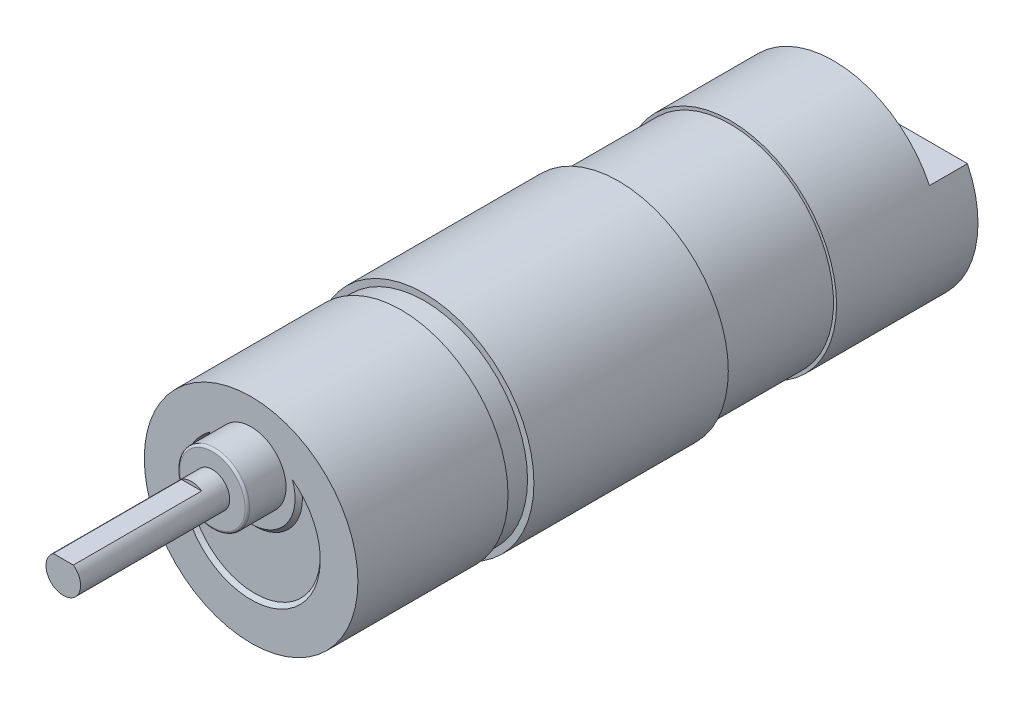
ISO-10303-21;
HEADER;
FILE_DESCRIPTION(('STEP AP214'),'2;1');
FILE_NAME('part.step','',(''),(''),'','','');
FILE_SCHEMA(('AUTOMOTIVE_DESIGN { 1 0 10303 214 1 1 1 1 }'));
ENDSEC;
DATA;
#1=APPLICATION_CONTEXT('core data for automotive mechanical design processes');
#2=APPLICATION_PROTOCOL_DEFINITION('international standard','automotive_design',2000,#1);
#3=PRODUCT_CONTEXT('',#1,'mechanical');
#4=PRODUCT('Part','Part','',(#3));
#5=PRODUCT_RELATED_PRODUCT_CATEGORY('part','',(#4));
#6=PRODUCT_DEFINITION_FORMATION('','',#4);
#7=PRODUCT_DEFINITION_CONTEXT('part definition',#1,'design');
#8=PRODUCT_DEFINITION('design','',#6,#7);
#9=PRODUCT_DEFINITION_SHAPE('','',#8);
#10=(LENGTH_UNIT() NAMED_UNIT(*) SI_UNIT(.MILLI.,.METRE.));
#11=(NAMED_UNIT(*) PLANE_ANGLE_UNIT() SI_UNIT($,.RADIAN.));
#12=(NAMED_UNIT(*) SI_UNIT($,.STERADIAN.) SOLID_ANGLE_UNIT());
#13=UNCERTAINTY_MEASURE_WITH_UNIT(LENGTH_MEASURE(1.E-05),#10,'distance_accuracy_value','');
#14=(GEOMETRIC_REPRESENTATION_CONTEXT(3) GLOBAL_UNCERTAINTY_ASSIGNED_CONTEXT((#13)) GLOBAL_UNIT_ASSIGNED_CONTEXT((#10,
#11,#12)) REPRESENTATION_CONTEXT('',''));
#15=CARTESIAN_POINT('',(0.,0.,0.));
#16=DIRECTION('',(0.,0.,1.));
#17=DIRECTION('',(1.,0.,0.));
#18=AXIS2_PLACEMENT_3D('',#15,#16,#17);
#19=CARTESIAN_POINT('',(0.,0.,-83.0072));
#20=DIRECTION('',(0.,0.,1.));
#21=DIRECTION('',(1.,0.,0.));
#22=AXIS2_PLACEMENT_3D('',#19,#20,#21);
#23=CYLINDRICAL_SURFACE('',#22,17.8943);
#24=CARTESIAN_POINT('',(0.,0.,-26.0096));
#25=DIRECTION('',(0.,0.,1.));
#26=DIRECTION('',(1.,0.,0.));
#27=AXIS2_PLACEMENT_3D('',#24,#25,#26);
#28=CIRCLE('',#27,17.8943);
#29=CARTESIAN_POINT('',(17.8943,0.,-26.0096));
#30=VERTEX_POINT('',#29);
#31=EDGE_CURVE('E157',#30,#30,#28,.F.);
#32=ORIENTED_EDGE('',*,*,#31,.T.);
#33=EDGE_LOOP('',(#32));
#34=FACE_BOUND('',#33,.T.);
#35=CARTESIAN_POINT('',(0.,0.,-29.9974));
#36=DIRECTION('',(0.,0.,-1.));
#37=DIRECTION('',(-1.,0.,0.));
#38=AXIS2_PLACEMENT_3D('',#35,#36,#37);
#39=CIRCLE('',#38,17.8943);
#40=CARTESIAN_POINT('',(-17.8943,0.,-29.9974));
#41=VERTEX_POINT('',#40);
#42=EDGE_CURVE('E162',#41,#41,#39,.T.);
#43=ORIENTED_EDGE('',*,*,#42,.F.);
#44=EDGE_LOOP('',(#43));
#45=FACE_BOUND('',#44,.T.);
#46=ADVANCED_FACE('F37',(#34,#45),#23,.T.);
#47=CARTESIAN_POINT('',(0.,0.,-26.0096));
#48=DIRECTION('',(0.,0.,1.));
#49=DIRECTION('',(1.,0.,0.));
#50=AXIS2_PLACEMENT_3D('',#47,#48,#49);
#51=CYLINDRICAL_SURFACE('',#50,18.5039);
#52=CARTESIAN_POINT('',(0.,0.,-26.0096));
#53=DIRECTION('',(0.,0.,1.));
#54=DIRECTION('',(1.,0.,0.));
#55=AXIS2_PLACEMENT_3D('',#52,#53,#54);
#56=CIRCLE('',#55,18.5039);
#57=CARTESIAN_POINT('',(18.5039,0.,-26.0096));
#58=VERTEX_POINT('',#57);
#59=EDGE_CURVE('E154',#58,#58,#56,.T.);
#60=ORIENTED_EDGE('',*,*,#59,.T.);
#61=EDGE_LOOP('',(#60));
#62=FACE_BOUND('',#61,.T.);
#63=CARTESIAN_POINT('',(0.,0.,0.));
#64=DIRECTION('',(0.,0.,1.));
#65=DIRECTION('',(1.,0.,0.));
#66=AXIS2_PLACEMENT_3D('',#63,#64,#65);
#67=CIRCLE('',#66,18.5039);
#68=CARTESIAN_POINT('',(18.5039,0.,0.));
#69=VERTEX_POINT('',#68);
#70=EDGE_CURVE('E153',#69,#69,#67,.T.);
#71=ORIENTED_EDGE('',*,*,#70,.F.);
#72=EDGE_LOOP('',(#71));
#73=FACE_BOUND('',#72,.T.);
#74=ADVANCED_FACE('F188',(#62,#73),#51,.T.);
#75=CARTESIAN_POINT('',(0.,0.,-26.0096));
#76=DIRECTION('',(0.,0.,1.));
#77=DIRECTION('',(1.,0.,0.));
#78=AXIS2_PLACEMENT_3D('',#75,#76,#77);
#79=PLANE('',#78);
#80=ORIENTED_EDGE('',*,*,#31,.F.);
#81=EDGE_LOOP('',(#80));
#82=FACE_BOUND('',#81,.T.);
#83=ORIENTED_EDGE('',*,*,#59,.F.);
#84=EDGE_LOOP('',(#83));
#85=FACE_BOUND('',#84,.T.);
#86=ADVANCED_FACE('F192',(#82,#85),#79,.F.);
#87=CARTESIAN_POINT('',(0.,0.,0.));
#88=DIRECTION('',(0.,0.,1.));
#89=DIRECTION('',(1.,0.,0.));
#90=AXIS2_PLACEMENT_3D('',#87,#88,#89);
#91=PLANE('',#90);
#92=CARTESIAN_POINT('',(0.,7.92156223028329,0.));
#93=DIRECTION('',(0.,0.,1.));
#94=DIRECTION('',(1.,0.,0.));
#95=AXIS2_PLACEMENT_3D('',#92,#93,#94);
#96=CIRCLE('',#95,6.05155);
#97=CARTESIAN_POINT('',(6.05155,7.92156223028329,0.));
#98=VERTEX_POINT('',#97);
#99=EDGE_CURVE('E114',#98,#98,#96,.T.);
#100=ORIENTED_EDGE('',*,*,#99,.F.);
#101=EDGE_LOOP('',(#100));
#102=FACE_BOUND('',#101,.T.);
#103=CARTESIAN_POINT('',(0.,0.,0.));
#104=DIRECTION('',(0.,0.,1.));
#105=DIRECTION('',(1.,0.,0.));
#106=AXIS2_PLACEMENT_3D('',#103,#104,#105);
#107=CIRCLE('',#106,11.9888);
#108=CARTESIAN_POINT('',(-7.16096902388391,9.6151884057971,0.));
#109=VERTEX_POINT('',#108);
#110=CARTESIAN_POINT('',(7.16096902388391,9.6151884057971,0.));
#111=VERTEX_POINT('',#110);
#112=EDGE_CURVE('E122',#109,#111,#107,.T.);
#113=ORIENTED_EDGE('',*,*,#112,.F.);
#114=CARTESIAN_POINT('',(0.,7.0104,0.));
#115=DIRECTION('',(0.,0.,1.));
#116=DIRECTION('',(1.,0.,0.));
#117=AXIS2_PLACEMENT_3D('',#114,#115,#116);
#118=CIRCLE('',#117,7.62);
#119=EDGE_CURVE('E119',#109,#111,#118,.T.);
#120=ORIENTED_EDGE('',*,*,#119,.T.);
#121=EDGE_LOOP('',(#113,#120));
#122=FACE_BOUND('',#121,.T.);
#123=ORIENTED_EDGE('',*,*,#70,.T.);
#124=EDGE_LOOP('',(#123));
#125=FACE_BOUND('',#124,.T.);
#126=ADVANCED_FACE('F194',(#102,#122,#125),#91,.T.);
#127=CARTESIAN_POINT('',(0.,0.,-63.6778));
#128=DIRECTION('',(0.,0.,1.));
#129=DIRECTION('',(1.,0.,0.));
#130=AXIS2_PLACEMENT_3D('',#127,#128,#129);
#131=CYLINDRICAL_SURFACE('',#130,18.9992);
#132=CARTESIAN_POINT('',(0.,0.,-63.6778));
#133=DIRECTION('',(0.,0.,-1.));
#134=DIRECTION('',(-1.,0.,0.));
#135=AXIS2_PLACEMENT_3D('',#132,#133,#134);
#136=CIRCLE('',#135,18.9992);
#137=CARTESIAN_POINT('',(-18.9992,0.,-63.6778));
#138=VERTEX_POINT('',#137);
#139=EDGE_CURVE('E144',#138,#138,#136,.T.);
#140=ORIENTED_EDGE('',*,*,#139,.F.);
#141=EDGE_LOOP('',(#140));
#142=FACE_BOUND('',#141,.T.);
#143=CARTESIAN_POINT('',(0.,0.,-29.9974));
#144=DIRECTION('',(0.,0.,-1.));
#145=DIRECTION('',(-1.,0.,0.));
#146=AXIS2_PLACEMENT_3D('',#143,#144,#145);
#147=CIRCLE('',#146,18.9992);
#148=CARTESIAN_POINT('',(-18.9992,0.,-29.9974));
#149=VERTEX_POINT('',#148);
#150=EDGE_CURVE('E141',#149,#149,#147,.T.);
#151=ORIENTED_EDGE('',*,*,#150,.T.);
#152=EDGE_LOOP('',(#151));
#153=FACE_BOUND('',#152,.T.);
#154=ADVANCED_FACE('F197',(#142,#153),#131,.T.);
#155=CARTESIAN_POINT('',(0.,0.,-63.6778));
#156=DIRECTION('',(0.,0.,-1.));
#157=DIRECTION('',(-1.,0.,0.));
#158=AXIS2_PLACEMENT_3D('',#155,#156,#157);
#159=PLANE('',#158);
#160=CARTESIAN_POINT('',(0.,0.,-63.6778));
#161=DIRECTION('',(0.,0.,-1.));
#162=DIRECTION('',(-1.,0.,0.));
#163=AXIS2_PLACEMENT_3D('',#160,#161,#162);
#164=CIRCLE('',#163,17.8943);
#165=CARTESIAN_POINT('',(-17.8943,0.,-63.6778));
#166=VERTEX_POINT('',#165);
#167=EDGE_CURVE('E147',#166,#166,#164,.T.);
#168=ORIENTED_EDGE('',*,*,#167,.F.);
#169=EDGE_LOOP('',(#168));
#170=FACE_BOUND('',#169,.T.);
#171=ORIENTED_EDGE('',*,*,#139,.T.);
#172=EDGE_LOOP('',(#171));
#173=FACE_BOUND('',#172,.T.);
#174=ADVANCED_FACE('F210',(#170,#173),#159,.T.);
#175=CARTESIAN_POINT('',(0.,0.,-29.9974));
#176=DIRECTION('',(0.,0.,-1.));
#177=DIRECTION('',(-1.,0.,0.));
#178=AXIS2_PLACEMENT_3D('',#175,#176,#177);
#179=PLANE('',#178);
#180=ORIENTED_EDGE('',*,*,#42,.T.);
#181=EDGE_LOOP('',(#180));
#182=FACE_BOUND('',#181,.T.);
#183=ORIENTED_EDGE('',*,*,#150,.F.);
#184=EDGE_LOOP('',(#183));
#185=FACE_BOUND('',#184,.T.);
#186=ADVANCED_FACE('F206',(#182,#185),#179,.F.);
#187=ORIENTED_EDGE('',*,*,#167,.T.);
#188=EDGE_LOOP('',(#187));
#189=FACE_BOUND('',#188,.T.);
#190=CARTESIAN_POINT('',(0.,0.,-83.0072));
#191=DIRECTION('',(0.,0.,-1.));
#192=DIRECTION('',(-1.,0.,0.));
#193=AXIS2_PLACEMENT_3D('',#190,#191,#192);
#194=CIRCLE('',#193,17.8943);
#195=CARTESIAN_POINT('',(-17.8943,0.,-83.0072));
#196=VERTEX_POINT('',#195);
#197=EDGE_CURVE('E150',#196,#196,#194,.T.);
#198=ORIENTED_EDGE('',*,*,#197,.F.);
#199=EDGE_LOOP('',(#198));
#200=FACE_BOUND('',#199,.T.);
#201=ADVANCED_FACE('F202',(#189,#200),#23,.T.);
#202=CARTESIAN_POINT('',(0.,0.,-107.508801562747));
#203=DIRECTION('',(0.,0.,1.));
#204=DIRECTION('',(1.,0.,0.));
#205=AXIS2_PLACEMENT_3D('',#202,#203,#204);
#206=CYLINDRICAL_SURFACE('',#205,18.4277);
#207=CARTESIAN_POINT('',(0.,0.,-107.508801562747));
#208=DIRECTION('',(0.,0.,-1.));
#209=DIRECTION('',(-1.,0.,0.));
#210=AXIS2_PLACEMENT_3D('',#207,#208,#209);
#211=CIRCLE('',#210,18.4277);
#212=CARTESIAN_POINT('',(16.6001242853781,8.001,-107.508801562747));
#213=VERTEX_POINT('',#212);
#214=CARTESIAN_POINT('',(-16.6001242853781,8.001,-107.508801562747));
#215=VERTEX_POINT('',#214);
#216=EDGE_CURVE('E138',#213,#215,#211,.T.);
#217=ORIENTED_EDGE('',*,*,#216,.F.);
#218=DIRECTION('',(0.,0.,-1.));
#219=VECTOR('',#218,1.);
#220=CARTESIAN_POINT('',(16.6001242853781,8.001,-100.930201562747));
#221=LINE('',#220,#219);
#222=CARTESIAN_POINT('',(16.6001242853781,8.001,-100.930201562747));
#223=VERTEX_POINT('',#222);
#224=EDGE_CURVE('E133',#223,#213,#221,.T.);
#225=ORIENTED_EDGE('',*,*,#224,.F.);
#226=CARTESIAN_POINT('',(0.,0.,-100.930201562747));
#227=DIRECTION('',(0.,0.,-1.));
#228=DIRECTION('',(1.,0.,0.));
#229=AXIS2_PLACEMENT_3D('',#226,#227,#228);
#230=CIRCLE('',#229,18.4277);
#231=CARTESIAN_POINT('',(-16.6001242853781,8.001,-100.930201562747));
#232=VERTEX_POINT('',#231);
#233=EDGE_CURVE('E128',#232,#223,#230,.T.);
#234=ORIENTED_EDGE('',*,*,#233,.F.);
#235=DIRECTION('',(0.,0.,-1.));
#236=VECTOR('',#235,1.);
#237=CARTESIAN_POINT('',(-16.6001242853781,8.001,-100.930201562747));
#238=LINE('',#237,#236);
#239=EDGE_CURVE('E131',#232,#215,#238,.T.);
#240=ORIENTED_EDGE('',*,*,#239,.T.);
#241=EDGE_LOOP('',(#217,#225,#234,#240));
#242=FACE_BOUND('',#241,.T.);
#243=CARTESIAN_POINT('',(0.,0.,-83.0072));
#244=DIRECTION('',(0.,0.,-1.));
#245=DIRECTION('',(-1.,0.,0.));
#246=AXIS2_PLACEMENT_3D('',#243,#244,#245);
#247=CIRCLE('',#246,18.4277);
#248=CARTESIAN_POINT('',(-18.4277,0.,-83.0072));
#249=VERTEX_POINT('',#248);
#250=EDGE_CURVE('E135',#249,#249,#247,.T.);
#251=ORIENTED_EDGE('',*,*,#250,.T.);
#252=EDGE_LOOP('',(#251));
#253=FACE_BOUND('',#252,.T.);
#254=ADVANCED_FACE('F205',(#242,#253),#206,.T.);
#255=CARTESIAN_POINT('',(0.,0.,-107.508801562747));
#256=DIRECTION('',(0.,0.,-1.));
#257=DIRECTION('',(-1.,0.,0.));
#258=AXIS2_PLACEMENT_3D('',#255,#256,#257);
#259=PLANE('',#258);
#260=DIRECTION('',(-1.,0.,0.));
#261=VECTOR('',#260,1.);
#262=CARTESIAN_POINT('',(0.,8.001,-107.508801562747));
#263=LINE('',#262,#261);
#264=EDGE_CURVE('E125',#213,#215,#263,.T.);
#265=ORIENTED_EDGE('',*,*,#264,.F.);
#266=ORIENTED_EDGE('',*,*,#216,.T.);
#267=EDGE_LOOP('',(#265,#266));
#268=FACE_BOUND('',#267,.T.);
#269=ADVANCED_FACE('F220',(#268),#259,.T.);
#270=CARTESIAN_POINT('',(0.,0.,-83.0072));
#271=DIRECTION('',(0.,0.,-1.));
#272=DIRECTION('',(-1.,0.,0.));
#273=AXIS2_PLACEMENT_3D('',#270,#271,#272);
#274=PLANE('',#273);
#275=ORIENTED_EDGE('',*,*,#197,.T.);
#276=EDGE_LOOP('',(#275));
#277=FACE_BOUND('',#276,.T.);
#278=ORIENTED_EDGE('',*,*,#250,.F.);
#279=EDGE_LOOP('',(#278));
#280=FACE_BOUND('',#279,.T.);
#281=ADVANCED_FACE('F222',(#277,#280),#274,.F.);
#282=CARTESIAN_POINT('',(0.,8.001,-100.930201562747));
#283=DIRECTION('',(0.,-1.,0.));
#284=DIRECTION('',(0.,0.,-1.));
#285=AXIS2_PLACEMENT_3D('',#282,#283,#284);
#286=PLANE('',#285);
#287=ORIENTED_EDGE('',*,*,#264,.T.);
#288=ORIENTED_EDGE('',*,*,#239,.F.);
#289=DIRECTION('',(-1.,0.,0.));
#290=VECTOR('',#289,1.);
#291=CARTESIAN_POINT('',(0.,8.001,-100.930201562747));
#292=LINE('',#291,#290);
#293=EDGE_CURVE('E126',#223,#232,#292,.T.);
#294=ORIENTED_EDGE('',*,*,#293,.F.);
#295=ORIENTED_EDGE('',*,*,#224,.T.);
#296=EDGE_LOOP('',(#287,#288,#294,#295));
#297=FACE_BOUND('',#296,.T.);
#298=ADVANCED_FACE('F225',(#297),#286,.F.);
#299=CARTESIAN_POINT('',(0.,0.,-100.930201562747));
#300=DIRECTION('',(0.,0.,1.));
#301=DIRECTION('',(1.,0.,0.));
#302=AXIS2_PLACEMENT_3D('',#299,#300,#301);
#303=PLANE('',#302);
#304=ORIENTED_EDGE('',*,*,#293,.T.);
#305=ORIENTED_EDGE('',*,*,#233,.T.);
#306=EDGE_LOOP('',(#304,#305));
#307=FACE_BOUND('',#306,.T.);
#308=ADVANCED_FACE('F232',(#307),#303,.F.);
#309=CARTESIAN_POINT('',(0.,0.,-0.635));
#310=DIRECTION('',(0.,0.,1.));
#311=DIRECTION('',(1.,0.,0.));
#312=AXIS2_PLACEMENT_3D('',#309,#310,#311);
#313=PLANE('',#312);
#314=CARTESIAN_POINT('',(0.,7.0104,-0.635));
#315=DIRECTION('',(0.,0.,1.));
#316=DIRECTION('',(1.,0.,0.));
#317=AXIS2_PLACEMENT_3D('',#314,#315,#316);
#318=CIRCLE('',#317,8.25499999999998);
#319=CARTESIAN_POINT('',(8.21330621640134,7.8390289855073,-0.635));
#320=VERTEX_POINT('',#319);
#321=CARTESIAN_POINT('',(-8.21330621640134,7.83902898550731,-0.635));
#322=VERTEX_POINT('',#321);
#323=EDGE_CURVE('E165',#320,#322,#318,.F.);
#324=ORIENTED_EDGE('',*,*,#323,.T.);
#325=CARTESIAN_POINT('',(0.,0.,-0.635));
#326=DIRECTION('',(0.,0.,1.));
#327=DIRECTION('',(1.,0.,0.));
#328=AXIS2_PLACEMENT_3D('',#325,#326,#327);
#329=CIRCLE('',#328,11.3538);
#330=EDGE_CURVE('E169',#322,#320,#329,.T.);
#331=ORIENTED_EDGE('',*,*,#330,.T.);
#332=EDGE_LOOP('',(#324,#331));
#333=FACE_BOUND('',#332,.T.);
#334=ADVANCED_FACE('F187',(#333),#313,.T.);
#335=CARTESIAN_POINT('',(0.,7.0104,-0.635));
#336=DIRECTION('',(0.,0.,-1.));
#337=DIRECTION('',(-1.,0.,0.));
#338=AXIS2_PLACEMENT_3D('',#335,#336,#337);
#339=CONICAL_SURFACE('',#338,8.25499999999998,0.785398163397452);
#340=ORIENTED_EDGE('',*,*,#323,.F.);
#341=CARTESIAN_POINT('',(8.21330621640134,7.83902898550731,-0.635));
#342=CARTESIAN_POINT('',(8.14152929614728,7.99499560124808,-0.579239914675001));
#343=CARTESIAN_POINT('',(8.06569260968287,8.14931297004859,-0.524069456393461));
#344=CARTESIAN_POINT('',(7.90617257293286,8.4538186169913,-0.415204743184464));
#345=CARTESIAN_POINT('',(7.82250970942651,8.60401641463799,-0.361507084910949));
#346=CARTESIAN_POINT('',(7.6472336217827,8.90026856802178,-0.255593102635168));
#347=CARTESIAN_POINT('',(7.55561949035811,9.04632244838353,-0.203376948585767));
#348=CARTESIAN_POINT('',(7.36430390337526,9.33417378205768,-0.100466368217495));
#349=CARTESIAN_POINT('',(7.26458238321428,9.47595940705178,-0.0497761706754428));
#350=CARTESIAN_POINT('',(7.16096902388392,9.61518840579711,0.));
#351=B_SPLINE_CURVE_WITH_KNOTS('',3,(#341,#342,#343,#344,#345,#346,#347,#348,#349,#350),
.UNSPECIFIED.,.F.,.F.,(4,2,2,2,4),(0.,0.541509848931271,1.08163985677264,1.62183157790518,
2.16340345690313),.UNSPECIFIED.);
#352=EDGE_CURVE('E177',#320,#111,#351,.T.);
#353=ORIENTED_EDGE('',*,*,#352,.T.);
#354=ORIENTED_EDGE('',*,*,#119,.F.);
#355=CARTESIAN_POINT('',(-7.16096902388391,9.6151884057971,0.));
#356=CARTESIAN_POINT('',(-7.26458238321427,9.47595940705177,-0.0497761706754441));
#357=CARTESIAN_POINT('',(-7.36430390337526,9.33417378205768,-0.100466368217495));
#358=CARTESIAN_POINT('',(-7.55561949035811,9.04632244838353,-0.203376948585766));
#359=CARTESIAN_POINT('',(-7.6472336217827,8.90026856802178,-0.255593102635168));
#360=CARTESIAN_POINT('',(-7.82250970942651,8.60401641463799,-0.36150708491095));
#361=CARTESIAN_POINT('',(-7.90617257293286,8.4538186169913,-0.415204743184464));
#362=CARTESIAN_POINT('',(-8.06569260968287,8.14931297004859,-0.524069456393461));
#363=CARTESIAN_POINT('',(-8.14152929614728,7.99499560124808,-0.579239914675));
#364=CARTESIAN_POINT('',(-8.21330621640134,7.83902898550731,-0.635));
#365=B_SPLINE_CURVE_WITH_KNOTS('',3,(#355,#356,#357,#358,#359,#360,#361,#362,#363,#364),
.UNSPECIFIED.,.F.,.F.,(4,2,2,2,4),(0.,0.541571878997945,1.08176360013048,1.62189360797186,
2.16340345690313),.UNSPECIFIED.);
#366=EDGE_CURVE('E60',#109,#322,#365,.T.);
#367=ORIENTED_EDGE('',*,*,#366,.T.);
#368=EDGE_LOOP('',(#340,#353,#354,#367));
#369=FACE_BOUND('',#368,.T.);
#370=ADVANCED_FACE('F183',(#369),#339,.T.);
#371=CARTESIAN_POINT('',(0.,0.,-0.635));
#372=DIRECTION('',(0.,0.,1.));
#373=DIRECTION('',(1.,0.,0.));
#374=AXIS2_PLACEMENT_3D('',#371,#372,#373);
#375=CONICAL_SURFACE('',#374,11.3538,0.785398163397454);
#376=ORIENTED_EDGE('',*,*,#366,.F.);
#377=ORIENTED_EDGE('',*,*,#112,.T.);
#378=ORIENTED_EDGE('',*,*,#352,.F.);
#379=ORIENTED_EDGE('',*,*,#330,.F.);
#380=EDGE_LOOP('',(#376,#377,#378,#379));
#381=FACE_BOUND('',#380,.T.);
#382=ADVANCED_FACE('F181',(#381),#375,.F.);
#383=CARTESIAN_POINT('',(0.,7.92156223028329,6.7056));
#384=DIRECTION('',(0.,0.,-1.));
#385=DIRECTION('',(-1.,0.,0.));
#386=AXIS2_PLACEMENT_3D('',#383,#384,#385);
#387=CYLINDRICAL_SURFACE('',#386,6.05155);
#388=CARTESIAN_POINT('',(0.,7.92156223028329,6.308725));
#389=DIRECTION('',(0.,0.,1.));
#390=DIRECTION('',(1.,0.,0.));
#391=AXIS2_PLACEMENT_3D('',#388,#389,#390);
#392=CIRCLE('',#391,6.05155);
#393=CARTESIAN_POINT('',(6.05155,7.92156223028329,6.308725));
#394=VERTEX_POINT('',#393);
#395=EDGE_CURVE('E11',#394,#394,#392,.F.);
#396=ORIENTED_EDGE('',*,*,#395,.T.);
#397=EDGE_LOOP('',(#396));
#398=FACE_BOUND('',#397,.T.);
#399=ORIENTED_EDGE('',*,*,#99,.T.);
#400=EDGE_LOOP('',(#399));
#401=FACE_BOUND('',#400,.T.);
#402=ADVANCED_FACE('F240',(#398,#401),#387,.T.);
#403=CARTESIAN_POINT('',(0.,7.92156223028329,6.7056));
#404=DIRECTION('',(0.,0.,1.));
#405=DIRECTION('',(1.,0.,0.));
#406=AXIS2_PLACEMENT_3D('',#403,#404,#405);
#407=PLANE('',#406);
#408=CARTESIAN_POINT('',(0.,7.92156223028329,6.7056));
#409=DIRECTION('',(0.,0.,1.));
#410=DIRECTION('',(1.,0.,0.));
#411=AXIS2_PLACEMENT_3D('',#408,#409,#410);
#412=CIRCLE('',#411,2.9972);
#413=CARTESIAN_POINT('',(2.9972,7.92156223028329,6.7056));
#414=VERTEX_POINT('',#413);
#415=EDGE_CURVE('E110',#414,#414,#412,.T.);
#416=ORIENTED_EDGE('',*,*,#415,.F.);
#417=EDGE_LOOP('',(#416));
#418=FACE_BOUND('',#417,.T.);
#419=CARTESIAN_POINT('',(0.,7.92156223028329,6.7056));
#420=DIRECTION('',(0.,0.,1.));
#421=DIRECTION('',(1.,0.,0.));
#422=AXIS2_PLACEMENT_3D('',#419,#420,#421);
#423=CIRCLE('',#422,5.654675);
#424=CARTESIAN_POINT('',(5.654675,7.92156223028329,6.7056));
#425=VERTEX_POINT('',#424);
#426=EDGE_CURVE('E45',#425,#425,#423,.T.);
#427=ORIENTED_EDGE('',*,*,#426,.T.);
#428=EDGE_LOOP('',(#427));
#429=FACE_BOUND('',#428,.T.);
#430=ADVANCED_FACE('F243',(#418,#429),#407,.T.);
#431=CARTESIAN_POINT('',(0.,7.92156223028329,6.308725));
#432=DIRECTION('',(0.,0.,1.));
#433=DIRECTION('',(1.,0.,0.));
#434=AXIS2_PLACEMENT_3D('',#431,#432,#433);
#435=TOROIDAL_SURFACE('',#434,5.654675,0.396875);
#436=ORIENTED_EDGE('',*,*,#395,.F.);
#437=EDGE_LOOP('',(#436));
#438=FACE_BOUND('',#437,.T.);
#439=ORIENTED_EDGE('',*,*,#426,.F.);
#440=EDGE_LOOP('',(#439));
#441=FACE_BOUND('',#440,.T.);
#442=ADVANCED_FACE('F39',(#438,#441),#435,.T.);
#443=CARTESIAN_POINT('',(0.,7.92156223028329,32.5374));
#444=DIRECTION('',(0.,0.,-1.));
#445=DIRECTION('',(-1.,0.,0.));
#446=AXIS2_PLACEMENT_3D('',#443,#444,#445);
#447=CYLINDRICAL_SURFACE('',#446,2.9972);
#448=CARTESIAN_POINT('',(0.,7.92156223028329,32.5374));
#449=DIRECTION('',(0.,0.,1.));
#450=DIRECTION('',(1.,0.,0.));
#451=AXIS2_PLACEMENT_3D('',#448,#449,#450);
#452=CIRCLE('',#451,2.9972);
#453=CARTESIAN_POINT('',(-1.7428176267183,10.3599622302833,32.5374));
#454=VERTEX_POINT('',#453);
#455=CARTESIAN_POINT('',(1.7428176267183,10.3599622302833,32.5374));
#456=VERTEX_POINT('',#455);
#457=EDGE_CURVE('E112',#454,#456,#452,.T.);
#458=ORIENTED_EDGE('',*,*,#457,.F.);
#459=DIRECTION('',(0.,0.,1.));
#460=VECTOR('',#459,1.);
#461=CARTESIAN_POINT('',(-1.7428176267183,10.3599622302833,10.3124));
#462=LINE('',#461,#460);
#463=CARTESIAN_POINT('',(-1.7428176267183,10.3599622302833,10.3124));
#464=VERTEX_POINT('',#463);
#465=EDGE_CURVE('E52',#464,#454,#462,.T.);
#466=ORIENTED_EDGE('',*,*,#465,.F.);
#467=CARTESIAN_POINT('',(0.,7.92156223028329,10.3124));
#468=DIRECTION('',(0.,0.,1.));
#469=DIRECTION('',(-1.,0.,0.));
#470=AXIS2_PLACEMENT_3D('',#467,#468,#469);
#471=CIRCLE('',#470,2.9972);
#472=CARTESIAN_POINT('',(1.7428176267183,10.3599622302833,10.3124));
#473=VERTEX_POINT('',#472);
#474=EDGE_CURVE('E100',#473,#464,#471,.T.);
#475=ORIENTED_EDGE('',*,*,#474,.F.);
#476=DIRECTION('',(0.,0.,1.));
#477=VECTOR('',#476,1.);
#478=CARTESIAN_POINT('',(1.7428176267183,10.3599622302833,10.3124));
#479=LINE('',#478,#477);
#480=EDGE_CURVE('E90',#473,#456,#479,.T.);
#481=ORIENTED_EDGE('',*,*,#480,.T.);
#482=EDGE_LOOP('',(#458,#466,#475,#481));
#483=FACE_BOUND('',#482,.T.);
#484=ORIENTED_EDGE('',*,*,#415,.T.);
#485=EDGE_LOOP('',(#484));
#486=FACE_BOUND('',#485,.T.);
#487=ADVANCED_FACE('F105',(#483,#486),#447,.T.);
#488=CARTESIAN_POINT('',(0.,7.92156223028329,32.5374));
#489=DIRECTION('',(0.,0.,1.));
#490=DIRECTION('',(1.,0.,0.));
#491=AXIS2_PLACEMENT_3D('',#488,#489,#490);
#492=PLANE('',#491);
#493=DIRECTION('',(1.,0.,0.));
#494=VECTOR('',#493,1.);
#495=CARTESIAN_POINT('',(0.,10.3599622302833,32.5374));
#496=LINE('',#495,#494);
#497=EDGE_CURVE('E95',#454,#456,#496,.T.);
#498=ORIENTED_EDGE('',*,*,#497,.F.);
#499=ORIENTED_EDGE('',*,*,#457,.T.);
#500=EDGE_LOOP('',(#498,#499));
#501=FACE_BOUND('',#500,.T.);
#502=ADVANCED_FACE('F250',(#501),#492,.T.);
#503=CARTESIAN_POINT('',(0.,10.3599622302833,10.3124));
#504=DIRECTION('',(0.,-1.,0.));
#505=DIRECTION('',(0.,0.,-1.));
#506=AXIS2_PLACEMENT_3D('',#503,#504,#505);
#507=PLANE('',#506);
#508=ORIENTED_EDGE('',*,*,#497,.T.);
#509=ORIENTED_EDGE('',*,*,#480,.F.);
#510=DIRECTION('',(1.,0.,0.));
#511=VECTOR('',#510,1.);
#512=CARTESIAN_POINT('',(0.,10.3599622302833,10.3124));
#513=LINE('',#512,#511);
#514=EDGE_CURVE('E93',#464,#473,#513,.T.);
#515=ORIENTED_EDGE('',*,*,#514,.F.);
#516=ORIENTED_EDGE('',*,*,#465,.T.);
#517=EDGE_LOOP('',(#508,#509,#515,#516));
#518=FACE_BOUND('',#517,.T.);
#519=ADVANCED_FACE('F92',(#518),#507,.F.);
#520=CARTESIAN_POINT('',(0.,7.92156223028329,10.3124));
#521=DIRECTION('',(0.,0.,-1.));
#522=DIRECTION('',(-1.,0.,0.));
#523=AXIS2_PLACEMENT_3D('',#520,#521,#522);
#524=PLANE('',#523);
#525=ORIENTED_EDGE('',*,*,#514,.T.);
#526=ORIENTED_EDGE('',*,*,#474,.T.);
#527=EDGE_LOOP('',(#525,#526));
#528=FACE_BOUND('',#527,.T.);
#529=ADVANCED_FACE('F103',(#528),#524,.F.);
#530=CLOSED_SHELL('',(#46,#74,#86,#126,#154,#174,#186,#201,#254,#269,#281,#298,#308,#334,#370,
#382,#402,#430,#442,#487,#502,#519,#529));
#531=MANIFOLD_SOLID_BREP('B2',#530);
#532=ADVANCED_BREP_SHAPE_REPRESENTATION('',(#18,#531),#14);
#533=SHAPE_DEFINITION_REPRESENTATION(#9,#532);
ENDSEC;
END-ISO-10303-21;
